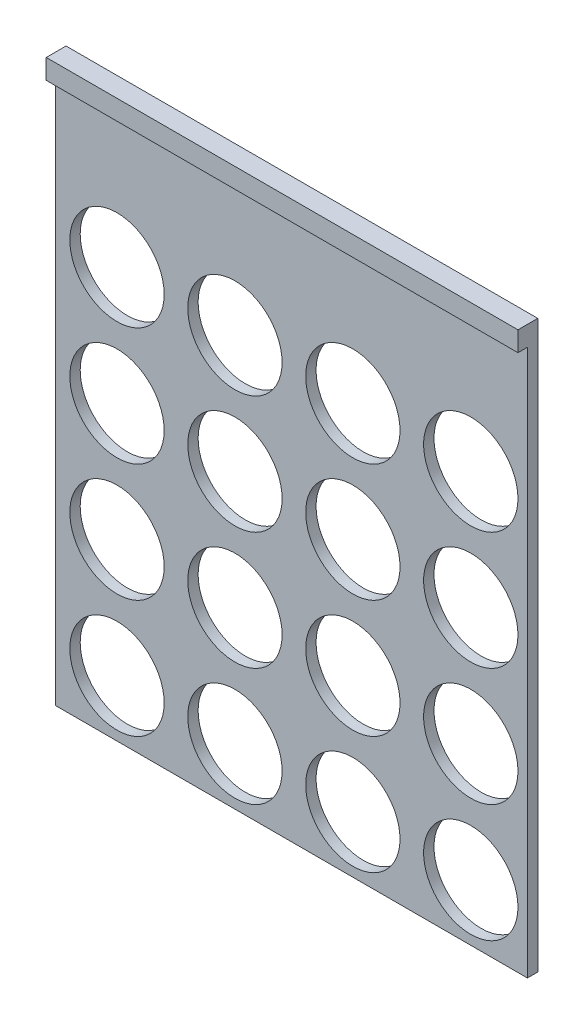
ISO-10303-21;
HEADER;
FILE_DESCRIPTION(('STEP AP214'),'2;1');
FILE_NAME('part.step','',(''),(''),'','','');
FILE_SCHEMA(('AUTOMOTIVE_DESIGN { 1 0 10303 214 1 1 1 1 }'));
ENDSEC;
DATA;
#1=APPLICATION_CONTEXT('core data for automotive mechanical design processes');
#2=APPLICATION_PROTOCOL_DEFINITION('international standard','automotive_design',2000,#1);
#3=PRODUCT_CONTEXT('',#1,'mechanical');
#4=PRODUCT('Part','Part','',(#3));
#5=PRODUCT_RELATED_PRODUCT_CATEGORY('part','',(#4));
#6=PRODUCT_DEFINITION_FORMATION('','',#4);
#7=PRODUCT_DEFINITION_CONTEXT('part definition',#1,'design');
#8=PRODUCT_DEFINITION('design','',#6,#7);
#9=PRODUCT_DEFINITION_SHAPE('','',#8);
#10=(LENGTH_UNIT() NAMED_UNIT(*) SI_UNIT(.MILLI.,.METRE.));
#11=(NAMED_UNIT(*) PLANE_ANGLE_UNIT() SI_UNIT($,.RADIAN.));
#12=(NAMED_UNIT(*) SI_UNIT($,.STERADIAN.) SOLID_ANGLE_UNIT());
#13=UNCERTAINTY_MEASURE_WITH_UNIT(LENGTH_MEASURE(1.E-05),#10,'distance_accuracy_value','');
#14=(GEOMETRIC_REPRESENTATION_CONTEXT(3) GLOBAL_UNCERTAINTY_ASSIGNED_CONTEXT((#13)) GLOBAL_UNIT_ASSIGNED_CONTEXT((#10,
#11,#12)) REPRESENTATION_CONTEXT('',''));
#15=CARTESIAN_POINT('',(0.,0.,0.));
#16=DIRECTION('',(0.,0.,1.));
#17=DIRECTION('',(1.,0.,0.));
#18=AXIS2_PLACEMENT_3D('',#15,#16,#17);
#19=CARTESIAN_POINT('',(0.,0.,2.2));
#20=DIRECTION('',(0.,0.,-1.));
#21=DIRECTION('',(-1.,0.,0.));
#22=AXIS2_PLACEMENT_3D('',#19,#20,#21);
#23=PLANE('',#22);
#24=CARTESIAN_POINT('',(88.,12.,2.2));
#25=DIRECTION('',(0.,0.,1.));
#26=DIRECTION('',(1.,0.,0.));
#27=AXIS2_PLACEMENT_3D('',#24,#25,#26);
#28=CIRCLE('',#27,9.99999999999999);
#29=CARTESIAN_POINT('',(98.,12.,2.2));
#30=VERTEX_POINT('',#29);
#31=EDGE_CURVE('E117',#30,#30,#28,.T.);
#32=ORIENTED_EDGE('',*,*,#31,.F.);
#33=EDGE_LOOP('',(#32));
#34=FACE_BOUND('',#33,.T.);
#35=CARTESIAN_POINT('',(87.9999999999997,87.,2.2));
#36=DIRECTION('',(0.,0.,1.));
#37=DIRECTION('',(1.,0.,0.));
#38=AXIS2_PLACEMENT_3D('',#35,#36,#37);
#39=CIRCLE('',#38,9.99999999999999);
#40=CARTESIAN_POINT('',(97.9999999999997,87.,2.2));
#41=VERTEX_POINT('',#40);
#42=EDGE_CURVE('E228',#41,#41,#39,.T.);
#43=ORIENTED_EDGE('',*,*,#42,.F.);
#44=EDGE_LOOP('',(#43));
#45=FACE_BOUND('',#44,.T.);
#46=CARTESIAN_POINT('',(87.9999999999998,62.,2.2));
#47=DIRECTION('',(0.,0.,1.));
#48=DIRECTION('',(1.,0.,0.));
#49=AXIS2_PLACEMENT_3D('',#46,#47,#48);
#50=CIRCLE('',#49,9.99999999999999);
#51=CARTESIAN_POINT('',(97.9999999999998,62.,2.2));
#52=VERTEX_POINT('',#51);
#53=EDGE_CURVE('E248',#52,#52,#50,.T.);
#54=ORIENTED_EDGE('',*,*,#53,.F.);
#55=EDGE_LOOP('',(#54));
#56=FACE_BOUND('',#55,.T.);
#57=CARTESIAN_POINT('',(87.9999999999999,37.,2.2));
#58=DIRECTION('',(0.,0.,1.));
#59=DIRECTION('',(1.,0.,0.));
#60=AXIS2_PLACEMENT_3D('',#57,#58,#59);
#61=CIRCLE('',#60,9.99999999999999);
#62=CARTESIAN_POINT('',(97.9999999999999,37.,2.2));
#63=VERTEX_POINT('',#62);
#64=EDGE_CURVE('E239',#63,#63,#61,.T.);
#65=ORIENTED_EDGE('',*,*,#64,.F.);
#66=EDGE_LOOP('',(#65));
#67=FACE_BOUND('',#66,.T.);
#68=CARTESIAN_POINT('',(12.9999999999999,61.9999999999995,2.2));
#69=DIRECTION('',(0.,0.,1.));
#70=DIRECTION('',(1.,0.,0.));
#71=AXIS2_PLACEMENT_3D('',#68,#69,#70);
#72=CIRCLE('',#71,9.99999999999999);
#73=CARTESIAN_POINT('',(22.9999999999999,61.9999999999995,2.2));
#74=VERTEX_POINT('',#73);
#75=EDGE_CURVE('E240',#74,#74,#72,.T.);
#76=ORIENTED_EDGE('',*,*,#75,.F.);
#77=EDGE_LOOP('',(#76));
#78=FACE_BOUND('',#77,.T.);
#79=CARTESIAN_POINT('',(62.9999999999998,86.9999999999998,2.2));
#80=DIRECTION('',(0.,0.,1.));
#81=DIRECTION('',(1.,0.,0.));
#82=AXIS2_PLACEMENT_3D('',#79,#80,#81);
#83=CIRCLE('',#82,9.99999999999999);
#84=CARTESIAN_POINT('',(72.9999999999997,86.9999999999998,2.2));
#85=VERTEX_POINT('',#84);
#86=EDGE_CURVE('E235',#85,#85,#83,.T.);
#87=ORIENTED_EDGE('',*,*,#86,.F.);
#88=EDGE_LOOP('',(#87));
#89=FACE_BOUND('',#88,.T.);
#90=CARTESIAN_POINT('',(37.9999999999998,86.9999999999996,2.2));
#91=DIRECTION('',(0.,0.,1.));
#92=DIRECTION('',(1.,0.,0.));
#93=AXIS2_PLACEMENT_3D('',#90,#91,#92);
#94=CIRCLE('',#93,10.);
#95=CARTESIAN_POINT('',(47.9999999999998,86.9999999999996,2.2));
#96=VERTEX_POINT('',#95);
#97=EDGE_CURVE('E232',#96,#96,#94,.T.);
#98=ORIENTED_EDGE('',*,*,#97,.F.);
#99=EDGE_LOOP('',(#98));
#100=FACE_BOUND('',#99,.T.);
#101=CARTESIAN_POINT('',(12.9999999999998,86.9999999999994,2.2));
#102=DIRECTION('',(0.,0.,1.));
#103=DIRECTION('',(1.,0.,0.));
#104=AXIS2_PLACEMENT_3D('',#101,#102,#103);
#105=CIRCLE('',#104,9.99999999999999);
#106=CARTESIAN_POINT('',(22.9999999999998,86.9999999999994,2.2));
#107=VERTEX_POINT('',#106);
#108=EDGE_CURVE('E236',#107,#107,#105,.T.);
#109=ORIENTED_EDGE('',*,*,#108,.F.);
#110=EDGE_LOOP('',(#109));
#111=FACE_BOUND('',#110,.T.);
#112=CARTESIAN_POINT('',(62.9999999999999,36.9999999999998,2.2));
#113=DIRECTION('',(0.,0.,1.));
#114=DIRECTION('',(1.,0.,0.));
#115=AXIS2_PLACEMENT_3D('',#112,#113,#114);
#116=CIRCLE('',#115,9.99999999999999);
#117=CARTESIAN_POINT('',(72.9999999999999,36.9999999999998,2.2));
#118=VERTEX_POINT('',#117);
#119=EDGE_CURVE('E256',#118,#118,#116,.T.);
#120=ORIENTED_EDGE('',*,*,#119,.F.);
#121=EDGE_LOOP('',(#120));
#122=FACE_BOUND('',#121,.T.);
#123=CARTESIAN_POINT('',(13.,11.9999999999995,2.2));
#124=DIRECTION('',(0.,0.,1.));
#125=DIRECTION('',(1.,0.,0.));
#126=AXIS2_PLACEMENT_3D('',#123,#124,#125);
#127=CIRCLE('',#126,9.99999999999999);
#128=CARTESIAN_POINT('',(23.,11.9999999999995,2.2));
#129=VERTEX_POINT('',#128);
#130=EDGE_CURVE('E265',#129,#129,#127,.T.);
#131=ORIENTED_EDGE('',*,*,#130,.F.);
#132=EDGE_LOOP('',(#131));
#133=FACE_BOUND('',#132,.T.);
#134=CARTESIAN_POINT('',(38.,11.9999999999997,2.2));
#135=DIRECTION('',(0.,0.,1.));
#136=DIRECTION('',(1.,0.,0.));
#137=AXIS2_PLACEMENT_3D('',#134,#135,#136);
#138=CIRCLE('',#137,10.);
#139=CARTESIAN_POINT('',(48.,11.9999999999997,2.2));
#140=VERTEX_POINT('',#139);
#141=EDGE_CURVE('E204',#140,#140,#138,.T.);
#142=ORIENTED_EDGE('',*,*,#141,.F.);
#143=EDGE_LOOP('',(#142));
#144=FACE_BOUND('',#143,.T.);
#145=CARTESIAN_POINT('',(63.,11.9999999999998,2.2));
#146=DIRECTION('',(0.,0.,1.));
#147=DIRECTION('',(1.,0.,0.));
#148=AXIS2_PLACEMENT_3D('',#145,#146,#147);
#149=CIRCLE('',#148,10.);
#150=CARTESIAN_POINT('',(73.,11.9999999999998,2.2));
#151=VERTEX_POINT('',#150);
#152=EDGE_CURVE('E201',#151,#151,#149,.T.);
#153=ORIENTED_EDGE('',*,*,#152,.F.);
#154=EDGE_LOOP('',(#153));
#155=FACE_BOUND('',#154,.T.);
#156=CARTESIAN_POINT('',(37.9999999999999,36.9999999999996,2.2));
#157=DIRECTION('',(0.,0.,1.));
#158=DIRECTION('',(1.,0.,0.));
#159=AXIS2_PLACEMENT_3D('',#156,#157,#158);
#160=CIRCLE('',#159,9.99999999999999);
#161=CARTESIAN_POINT('',(47.9999999999999,36.9999999999996,2.2));
#162=VERTEX_POINT('',#161);
#163=EDGE_CURVE('E253',#162,#162,#160,.T.);
#164=ORIENTED_EDGE('',*,*,#163,.F.);
#165=EDGE_LOOP('',(#164));
#166=FACE_BOUND('',#165,.T.);
#167=CARTESIAN_POINT('',(13.,36.9999999999995,2.2));
#168=DIRECTION('',(0.,0.,1.));
#169=DIRECTION('',(1.,0.,0.));
#170=AXIS2_PLACEMENT_3D('',#167,#168,#169);
#171=CIRCLE('',#170,9.99999999999999);
#172=CARTESIAN_POINT('',(23.,36.9999999999995,2.2));
#173=VERTEX_POINT('',#172);
#174=EDGE_CURVE('E257',#173,#173,#171,.T.);
#175=ORIENTED_EDGE('',*,*,#174,.F.);
#176=EDGE_LOOP('',(#175));
#177=FACE_BOUND('',#176,.T.);
#178=CARTESIAN_POINT('',(62.9999999999999,61.9999999999998,2.2));
#179=DIRECTION('',(0.,0.,1.));
#180=DIRECTION('',(1.,0.,0.));
#181=AXIS2_PLACEMENT_3D('',#178,#179,#180);
#182=CIRCLE('',#181,9.99999999999999);
#183=CARTESIAN_POINT('',(72.9999999999998,61.9999999999998,2.2));
#184=VERTEX_POINT('',#183);
#185=EDGE_CURVE('E260',#184,#184,#182,.T.);
#186=ORIENTED_EDGE('',*,*,#185,.F.);
#187=EDGE_LOOP('',(#186));
#188=FACE_BOUND('',#187,.T.);
#189=CARTESIAN_POINT('',(37.9999999999999,61.9999999999996,2.2));
#190=DIRECTION('',(0.,0.,1.));
#191=DIRECTION('',(1.,0.,0.));
#192=AXIS2_PLACEMENT_3D('',#189,#190,#191);
#193=CIRCLE('',#192,9.99999999999999);
#194=CARTESIAN_POINT('',(47.9999999999999,61.9999999999996,2.2));
#195=VERTEX_POINT('',#194);
#196=EDGE_CURVE('E243',#195,#195,#193,.T.);
#197=ORIENTED_EDGE('',*,*,#196,.F.);
#198=EDGE_LOOP('',(#197));
#199=FACE_BOUND('',#198,.T.);
#200=DIRECTION('',(1.,0.,0.));
#201=VECTOR('',#200,1.);
#202=CARTESIAN_POINT('',(0.,115.794440945344,2.2));
#203=LINE('',#202,#201);
#204=CARTESIAN_POINT('',(0.,115.794440945344,2.2));
#205=VERTEX_POINT('',#204);
#206=CARTESIAN_POINT('',(100.,115.794440945344,2.2));
#207=VERTEX_POINT('',#206);
#208=EDGE_CURVE('E50',#205,#207,#203,.T.);
#209=ORIENTED_EDGE('',*,*,#208,.F.);
#210=DIRECTION('',(0.,-1.,0.));
#211=VECTOR('',#210,1.);
#212=CARTESIAN_POINT('',(0.,0.,2.2));
#213=LINE('',#212,#211);
#214=CARTESIAN_POINT('',(0.,0.,2.2));
#215=VERTEX_POINT('',#214);
#216=EDGE_CURVE('E87',#205,#215,#213,.T.);
#217=ORIENTED_EDGE('',*,*,#216,.T.);
#218=DIRECTION('',(1.,0.,0.));
#219=VECTOR('',#218,1.);
#220=CARTESIAN_POINT('',(0.,0.,2.2));
#221=LINE('',#220,#219);
#222=CARTESIAN_POINT('',(100.,0.,2.2));
#223=VERTEX_POINT('',#222);
#224=EDGE_CURVE('E56',#215,#223,#221,.T.);
#225=ORIENTED_EDGE('',*,*,#224,.T.);
#226=DIRECTION('',(0.,1.,0.));
#227=VECTOR('',#226,1.);
#228=CARTESIAN_POINT('',(100.,0.,2.2));
#229=LINE('',#228,#227);
#230=EDGE_CURVE('E98',#223,#207,#229,.T.);
#231=ORIENTED_EDGE('',*,*,#230,.T.);
#232=EDGE_LOOP('',(#209,#217,#225,#231));
#233=FACE_BOUND('',#232,.T.);
#234=ADVANCED_FACE('F33',(#34,#45,#56,#67,#78,#89,#100,#111,#122,#133,#144,#155,#166,#177,#188,
#199,#233),#23,.F.);
#235=CARTESIAN_POINT('',(0.,0.,2.2));
#236=DIRECTION('',(1.,0.,0.));
#237=DIRECTION('',(0.,1.,0.));
#238=AXIS2_PLACEMENT_3D('',#235,#236,#237);
#239=PLANE('',#238);
#240=DIRECTION('',(0.,-1.,0.));
#241=VECTOR('',#240,1.);
#242=CARTESIAN_POINT('',(0.,0.,0.));
#243=LINE('',#242,#241);
#244=CARTESIAN_POINT('',(0.,120.,0.));
#245=VERTEX_POINT('',#244);
#246=CARTESIAN_POINT('',(0.,0.,0.));
#247=VERTEX_POINT('',#246);
#248=EDGE_CURVE('E94',#245,#247,#243,.T.);
#249=ORIENTED_EDGE('',*,*,#248,.T.);
#250=DIRECTION('',(0.,0.,-1.));
#251=VECTOR('',#250,1.);
#252=CARTESIAN_POINT('',(0.,0.,2.2));
#253=LINE('',#252,#251);
#254=EDGE_CURVE('E11',#215,#247,#253,.T.);
#255=ORIENTED_EDGE('',*,*,#254,.F.);
#256=ORIENTED_EDGE('',*,*,#216,.F.);
#257=DIRECTION('',(0.,0.,-1.));
#258=VECTOR('',#257,1.);
#259=CARTESIAN_POINT('',(0.,115.794440945344,4.2));
#260=LINE('',#259,#258);
#261=CARTESIAN_POINT('',(0.,115.794440945344,4.2));
#262=VERTEX_POINT('',#261);
#263=EDGE_CURVE('E221',#262,#205,#260,.T.);
#264=ORIENTED_EDGE('',*,*,#263,.F.);
#265=DIRECTION('',(0.,-1.,0.));
#266=VECTOR('',#265,1.);
#267=CARTESIAN_POINT('',(0.,120.,4.2));
#268=LINE('',#267,#266);
#269=CARTESIAN_POINT('',(0.,120.,4.2));
#270=VERTEX_POINT('',#269);
#271=EDGE_CURVE('E97',#270,#262,#268,.T.);
#272=ORIENTED_EDGE('',*,*,#271,.F.);
#273=DIRECTION('',(0.,0.,-1.));
#274=VECTOR('',#273,1.);
#275=CARTESIAN_POINT('',(0.,120.,2.2));
#276=LINE('',#275,#274);
#277=EDGE_CURVE('E80',#270,#245,#276,.T.);
#278=ORIENTED_EDGE('',*,*,#277,.T.);
#279=EDGE_LOOP('',(#249,#255,#256,#264,#272,#278));
#280=FACE_BOUND('',#279,.T.);
#281=ADVANCED_FACE('F35',(#280),#239,.F.);
#282=CARTESIAN_POINT('',(0.,0.,2.2));
#283=DIRECTION('',(0.,1.,0.));
#284=DIRECTION('',(0.,0.,1.));
#285=AXIS2_PLACEMENT_3D('',#282,#283,#284);
#286=PLANE('',#285);
#287=DIRECTION('',(1.,0.,0.));
#288=VECTOR('',#287,1.);
#289=CARTESIAN_POINT('',(0.,0.,0.));
#290=LINE('',#289,#288);
#291=CARTESIAN_POINT('',(100.,0.,0.));
#292=VERTEX_POINT('',#291);
#293=EDGE_CURVE('E101',#247,#292,#290,.T.);
#294=ORIENTED_EDGE('',*,*,#293,.T.);
#295=DIRECTION('',(0.,0.,-1.));
#296=VECTOR('',#295,1.);
#297=CARTESIAN_POINT('',(100.,0.,2.2));
#298=LINE('',#297,#296);
#299=EDGE_CURVE('E42',#223,#292,#298,.T.);
#300=ORIENTED_EDGE('',*,*,#299,.F.);
#301=ORIENTED_EDGE('',*,*,#224,.F.);
#302=ORIENTED_EDGE('',*,*,#254,.T.);
#303=EDGE_LOOP('',(#294,#300,#301,#302));
#304=FACE_BOUND('',#303,.T.);
#305=ADVANCED_FACE('F325',(#304),#286,.F.);
#306=CARTESIAN_POINT('',(100.,0.,2.2));
#307=DIRECTION('',(-1.,0.,0.));
#308=DIRECTION('',(0.,-1.,0.));
#309=AXIS2_PLACEMENT_3D('',#306,#307,#308);
#310=PLANE('',#309);
#311=DIRECTION('',(0.,1.,0.));
#312=VECTOR('',#311,1.);
#313=CARTESIAN_POINT('',(100.,0.,0.));
#314=LINE('',#313,#312);
#315=CARTESIAN_POINT('',(100.,120.,0.));
#316=VERTEX_POINT('',#315);
#317=EDGE_CURVE('E88',#292,#316,#314,.T.);
#318=ORIENTED_EDGE('',*,*,#317,.T.);
#319=DIRECTION('',(0.,0.,-1.));
#320=VECTOR('',#319,1.);
#321=CARTESIAN_POINT('',(100.,120.,2.2));
#322=LINE('',#321,#320);
#323=CARTESIAN_POINT('',(100.,120.,4.2));
#324=VERTEX_POINT('',#323);
#325=EDGE_CURVE('E83',#324,#316,#322,.T.);
#326=ORIENTED_EDGE('',*,*,#325,.F.);
#327=DIRECTION('',(0.,1.,0.));
#328=VECTOR('',#327,1.);
#329=CARTESIAN_POINT('',(100.,120.,4.2));
#330=LINE('',#329,#328);
#331=CARTESIAN_POINT('',(100.,115.794440945344,4.2));
#332=VERTEX_POINT('',#331);
#333=EDGE_CURVE('E225',#332,#324,#330,.T.);
#334=ORIENTED_EDGE('',*,*,#333,.F.);
#335=DIRECTION('',(0.,0.,-1.));
#336=VECTOR('',#335,1.);
#337=CARTESIAN_POINT('',(100.,115.794440945344,4.2));
#338=LINE('',#337,#336);
#339=EDGE_CURVE('E219',#332,#207,#338,.T.);
#340=ORIENTED_EDGE('',*,*,#339,.T.);
#341=ORIENTED_EDGE('',*,*,#230,.F.);
#342=ORIENTED_EDGE('',*,*,#299,.T.);
#343=EDGE_LOOP('',(#318,#326,#334,#340,#341,#342));
#344=FACE_BOUND('',#343,.T.);
#345=ADVANCED_FACE('F223',(#344),#310,.F.);
#346=CARTESIAN_POINT('',(0.,120.,2.2));
#347=DIRECTION('',(0.,-1.,0.));
#348=DIRECTION('',(0.,0.,-1.));
#349=AXIS2_PLACEMENT_3D('',#346,#347,#348);
#350=PLANE('',#349);
#351=DIRECTION('',(-1.,0.,0.));
#352=VECTOR('',#351,1.);
#353=CARTESIAN_POINT('',(0.,120.,0.));
#354=LINE('',#353,#352);
#355=EDGE_CURVE('E76',#316,#245,#354,.T.);
#356=ORIENTED_EDGE('',*,*,#355,.T.);
#357=ORIENTED_EDGE('',*,*,#277,.F.);
#358=DIRECTION('',(-1.,0.,0.));
#359=VECTOR('',#358,1.);
#360=CARTESIAN_POINT('',(0.,120.,4.2));
#361=LINE('',#360,#359);
#362=EDGE_CURVE('E226',#324,#270,#361,.T.);
#363=ORIENTED_EDGE('',*,*,#362,.F.);
#364=ORIENTED_EDGE('',*,*,#325,.T.);
#365=EDGE_LOOP('',(#356,#357,#363,#364));
#366=FACE_BOUND('',#365,.T.);
#367=ADVANCED_FACE('F78',(#366),#350,.F.);
#368=CARTESIAN_POINT('',(0.,0.,0.));
#369=DIRECTION('',(0.,0.,-1.));
#370=DIRECTION('',(-1.,0.,0.));
#371=AXIS2_PLACEMENT_3D('',#368,#369,#370);
#372=PLANE('',#371);
#373=CARTESIAN_POINT('',(37.9999999999999,61.9999999999996,0.));
#374=DIRECTION('',(0.,0.,-1.));
#375=DIRECTION('',(-1.,0.,0.));
#376=AXIS2_PLACEMENT_3D('',#373,#374,#375);
#377=CIRCLE('',#376,9.99999999999999);
#378=CARTESIAN_POINT('',(27.9999999999999,61.9999999999996,0.));
#379=VERTEX_POINT('',#378);
#380=EDGE_CURVE('E37',#379,#379,#377,.T.);
#381=ORIENTED_EDGE('',*,*,#380,.F.);
#382=EDGE_LOOP('',(#381));
#383=FACE_BOUND('',#382,.T.);
#384=CARTESIAN_POINT('',(62.9999999999999,61.9999999999998,0.));
#385=DIRECTION('',(0.,0.,-1.));
#386=DIRECTION('',(-1.,0.,0.));
#387=AXIS2_PLACEMENT_3D('',#384,#385,#386);
#388=CIRCLE('',#387,9.99999999999999);
#389=CARTESIAN_POINT('',(52.9999999999999,61.9999999999998,0.));
#390=VERTEX_POINT('',#389);
#391=EDGE_CURVE('E105',#390,#390,#388,.T.);
#392=ORIENTED_EDGE('',*,*,#391,.F.);
#393=EDGE_LOOP('',(#392));
#394=FACE_BOUND('',#393,.T.);
#395=CARTESIAN_POINT('',(13.,36.9999999999995,0.));
#396=DIRECTION('',(0.,0.,-1.));
#397=DIRECTION('',(-1.,0.,0.));
#398=AXIS2_PLACEMENT_3D('',#395,#396,#397);
#399=CIRCLE('',#398,9.99999999999999);
#400=CARTESIAN_POINT('',(2.99999999999996,36.9999999999995,0.));
#401=VERTEX_POINT('',#400);
#402=EDGE_CURVE('E153',#401,#401,#399,.T.);
#403=ORIENTED_EDGE('',*,*,#402,.F.);
#404=EDGE_LOOP('',(#403));
#405=FACE_BOUND('',#404,.T.);
#406=CARTESIAN_POINT('',(37.9999999999999,36.9999999999996,0.));
#407=DIRECTION('',(0.,0.,-1.));
#408=DIRECTION('',(-1.,0.,0.));
#409=AXIS2_PLACEMENT_3D('',#406,#407,#408);
#410=CIRCLE('',#409,9.99999999999999);
#411=CARTESIAN_POINT('',(27.9999999999999,36.9999999999996,0.));
#412=VERTEX_POINT('',#411);
#413=EDGE_CURVE('E150',#412,#412,#410,.T.);
#414=ORIENTED_EDGE('',*,*,#413,.F.);
#415=EDGE_LOOP('',(#414));
#416=FACE_BOUND('',#415,.T.);
#417=CARTESIAN_POINT('',(63.,11.9999999999998,0.));
#418=DIRECTION('',(0.,0.,-1.));
#419=DIRECTION('',(-1.,0.,0.));
#420=AXIS2_PLACEMENT_3D('',#417,#418,#419);
#421=CIRCLE('',#420,10.);
#422=CARTESIAN_POINT('',(53.,11.9999999999998,0.));
#423=VERTEX_POINT('',#422);
#424=EDGE_CURVE('E147',#423,#423,#421,.T.);
#425=ORIENTED_EDGE('',*,*,#424,.F.);
#426=EDGE_LOOP('',(#425));
#427=FACE_BOUND('',#426,.T.);
#428=CARTESIAN_POINT('',(38.,11.9999999999997,0.));
#429=DIRECTION('',(0.,0.,-1.));
#430=DIRECTION('',(-1.,0.,0.));
#431=AXIS2_PLACEMENT_3D('',#428,#429,#430);
#432=CIRCLE('',#431,10.);
#433=CARTESIAN_POINT('',(28.,11.9999999999997,0.));
#434=VERTEX_POINT('',#433);
#435=EDGE_CURVE('E144',#434,#434,#432,.T.);
#436=ORIENTED_EDGE('',*,*,#435,.F.);
#437=EDGE_LOOP('',(#436));
#438=FACE_BOUND('',#437,.T.);
#439=CARTESIAN_POINT('',(13.,11.9999999999995,0.));
#440=DIRECTION('',(0.,0.,-1.));
#441=DIRECTION('',(-1.,0.,0.));
#442=AXIS2_PLACEMENT_3D('',#439,#440,#441);
#443=CIRCLE('',#442,9.99999999999999);
#444=CARTESIAN_POINT('',(3.00000000000004,11.9999999999995,0.));
#445=VERTEX_POINT('',#444);
#446=EDGE_CURVE('E141',#445,#445,#443,.T.);
#447=ORIENTED_EDGE('',*,*,#446,.F.);
#448=EDGE_LOOP('',(#447));
#449=FACE_BOUND('',#448,.T.);
#450=CARTESIAN_POINT('',(62.9999999999999,36.9999999999998,0.));
#451=DIRECTION('',(0.,0.,-1.));
#452=DIRECTION('',(-1.,0.,0.));
#453=AXIS2_PLACEMENT_3D('',#450,#451,#452);
#454=CIRCLE('',#453,9.99999999999999);
#455=CARTESIAN_POINT('',(52.9999999999999,36.9999999999998,0.));
#456=VERTEX_POINT('',#455);
#457=EDGE_CURVE('E138',#456,#456,#454,.T.);
#458=ORIENTED_EDGE('',*,*,#457,.F.);
#459=EDGE_LOOP('',(#458));
#460=FACE_BOUND('',#459,.T.);
#461=CARTESIAN_POINT('',(12.9999999999998,86.9999999999994,0.));
#462=DIRECTION('',(0.,0.,-1.));
#463=DIRECTION('',(-1.,0.,0.));
#464=AXIS2_PLACEMENT_3D('',#461,#462,#463);
#465=CIRCLE('',#464,9.99999999999999);
#466=CARTESIAN_POINT('',(2.99999999999978,86.9999999999994,0.));
#467=VERTEX_POINT('',#466);
#468=EDGE_CURVE('E135',#467,#467,#465,.T.);
#469=ORIENTED_EDGE('',*,*,#468,.F.);
#470=EDGE_LOOP('',(#469));
#471=FACE_BOUND('',#470,.T.);
#472=CARTESIAN_POINT('',(37.9999999999998,86.9999999999996,0.));
#473=DIRECTION('',(0.,0.,-1.));
#474=DIRECTION('',(-1.,0.,0.));
#475=AXIS2_PLACEMENT_3D('',#472,#473,#474);
#476=CIRCLE('',#475,10.);
#477=CARTESIAN_POINT('',(27.9999999999998,86.9999999999996,0.));
#478=VERTEX_POINT('',#477);
#479=EDGE_CURVE('E132',#478,#478,#476,.T.);
#480=ORIENTED_EDGE('',*,*,#479,.F.);
#481=EDGE_LOOP('',(#480));
#482=FACE_BOUND('',#481,.T.);
#483=CARTESIAN_POINT('',(62.9999999999998,86.9999999999998,0.));
#484=DIRECTION('',(0.,0.,-1.));
#485=DIRECTION('',(-1.,0.,0.));
#486=AXIS2_PLACEMENT_3D('',#483,#484,#485);
#487=CIRCLE('',#486,9.99999999999999);
#488=CARTESIAN_POINT('',(52.9999999999998,86.9999999999998,0.));
#489=VERTEX_POINT('',#488);
#490=EDGE_CURVE('E129',#489,#489,#487,.T.);
#491=ORIENTED_EDGE('',*,*,#490,.F.);
#492=EDGE_LOOP('',(#491));
#493=FACE_BOUND('',#492,.T.);
#494=CARTESIAN_POINT('',(12.9999999999999,61.9999999999995,0.));
#495=DIRECTION('',(0.,0.,-1.));
#496=DIRECTION('',(-1.,0.,0.));
#497=AXIS2_PLACEMENT_3D('',#494,#495,#496);
#498=CIRCLE('',#497,9.99999999999999);
#499=CARTESIAN_POINT('',(2.99999999999987,61.9999999999995,0.));
#500=VERTEX_POINT('',#499);
#501=EDGE_CURVE('E126',#500,#500,#498,.T.);
#502=ORIENTED_EDGE('',*,*,#501,.F.);
#503=EDGE_LOOP('',(#502));
#504=FACE_BOUND('',#503,.T.);
#505=CARTESIAN_POINT('',(87.9999999999999,37.,0.));
#506=DIRECTION('',(0.,0.,-1.));
#507=DIRECTION('',(-1.,0.,0.));
#508=AXIS2_PLACEMENT_3D('',#505,#506,#507);
#509=CIRCLE('',#508,9.99999999999999);
#510=CARTESIAN_POINT('',(77.9999999999999,37.,0.));
#511=VERTEX_POINT('',#510);
#512=EDGE_CURVE('E123',#511,#511,#509,.T.);
#513=ORIENTED_EDGE('',*,*,#512,.F.);
#514=EDGE_LOOP('',(#513));
#515=FACE_BOUND('',#514,.T.);
#516=CARTESIAN_POINT('',(87.9999999999998,62.,0.));
#517=DIRECTION('',(0.,0.,-1.));
#518=DIRECTION('',(-1.,0.,0.));
#519=AXIS2_PLACEMENT_3D('',#516,#517,#518);
#520=CIRCLE('',#519,9.99999999999999);
#521=CARTESIAN_POINT('',(77.9999999999998,62.,0.));
#522=VERTEX_POINT('',#521);
#523=EDGE_CURVE('E120',#522,#522,#520,.T.);
#524=ORIENTED_EDGE('',*,*,#523,.F.);
#525=EDGE_LOOP('',(#524));
#526=FACE_BOUND('',#525,.T.);
#527=CARTESIAN_POINT('',(87.9999999999997,87.,0.));
#528=DIRECTION('',(0.,0.,-1.));
#529=DIRECTION('',(-1.,0.,0.));
#530=AXIS2_PLACEMENT_3D('',#527,#528,#529);
#531=CIRCLE('',#530,9.99999999999999);
#532=CARTESIAN_POINT('',(77.9999999999997,87.,0.));
#533=VERTEX_POINT('',#532);
#534=EDGE_CURVE('E116',#533,#533,#531,.T.);
#535=ORIENTED_EDGE('',*,*,#534,.F.);
#536=EDGE_LOOP('',(#535));
#537=FACE_BOUND('',#536,.T.);
#538=CARTESIAN_POINT('',(88.,12.,0.));
#539=DIRECTION('',(0.,0.,-1.));
#540=DIRECTION('',(-1.,0.,0.));
#541=AXIS2_PLACEMENT_3D('',#538,#539,#540);
#542=CIRCLE('',#541,9.99999999999999);
#543=CARTESIAN_POINT('',(78.,12.,0.));
#544=VERTEX_POINT('',#543);
#545=EDGE_CURVE('E113',#544,#544,#542,.T.);
#546=ORIENTED_EDGE('',*,*,#545,.F.);
#547=EDGE_LOOP('',(#546));
#548=FACE_BOUND('',#547,.T.);
#549=ORIENTED_EDGE('',*,*,#248,.F.);
#550=ORIENTED_EDGE('',*,*,#355,.F.);
#551=ORIENTED_EDGE('',*,*,#317,.F.);
#552=ORIENTED_EDGE('',*,*,#293,.F.);
#553=EDGE_LOOP('',(#549,#550,#551,#552));
#554=FACE_BOUND('',#553,.T.);
#555=ADVANCED_FACE('F100',(#383,#394,#405,#416,#427,#438,#449,#460,#471,#482,#493,#504,#515,
#526,#537,#548,#554),#372,.T.);
#556=CARTESIAN_POINT('',(88.,12.,-7.8));
#557=DIRECTION('',(0.,0.,1.));
#558=DIRECTION('',(1.,0.,0.));
#559=AXIS2_PLACEMENT_3D('',#556,#557,#558);
#560=CYLINDRICAL_SURFACE('',#559,9.99999999999999);
#561=ORIENTED_EDGE('',*,*,#545,.T.);
#562=EDGE_LOOP('',(#561));
#563=FACE_BOUND('',#562,.T.);
#564=ORIENTED_EDGE('',*,*,#31,.T.);
#565=EDGE_LOOP('',(#564));
#566=FACE_BOUND('',#565,.T.);
#567=ADVANCED_FACE('F163',(#563,#566),#560,.F.);
#568=CARTESIAN_POINT('',(87.9999999999997,87.,-7.8));
#569=DIRECTION('',(0.,0.,1.));
#570=DIRECTION('',(1.,0.,0.));
#571=AXIS2_PLACEMENT_3D('',#568,#569,#570);
#572=CYLINDRICAL_SURFACE('',#571,9.99999999999999);
#573=ORIENTED_EDGE('',*,*,#534,.T.);
#574=EDGE_LOOP('',(#573));
#575=FACE_BOUND('',#574,.T.);
#576=ORIENTED_EDGE('',*,*,#42,.T.);
#577=EDGE_LOOP('',(#576));
#578=FACE_BOUND('',#577,.T.);
#579=ADVANCED_FACE('F196',(#575,#578),#572,.F.);
#580=CARTESIAN_POINT('',(87.9999999999998,62.,-7.8));
#581=DIRECTION('',(0.,0.,1.));
#582=DIRECTION('',(1.,0.,0.));
#583=AXIS2_PLACEMENT_3D('',#580,#581,#582);
#584=CYLINDRICAL_SURFACE('',#583,9.99999999999999);
#585=ORIENTED_EDGE('',*,*,#523,.T.);
#586=EDGE_LOOP('',(#585));
#587=FACE_BOUND('',#586,.T.);
#588=ORIENTED_EDGE('',*,*,#53,.T.);
#589=EDGE_LOOP('',(#588));
#590=FACE_BOUND('',#589,.T.);
#591=ADVANCED_FACE('F365',(#587,#590),#584,.F.);
#592=CARTESIAN_POINT('',(87.9999999999999,37.,-7.8));
#593=DIRECTION('',(0.,0.,1.));
#594=DIRECTION('',(1.,0.,0.));
#595=AXIS2_PLACEMENT_3D('',#592,#593,#594);
#596=CYLINDRICAL_SURFACE('',#595,9.99999999999999);
#597=ORIENTED_EDGE('',*,*,#512,.T.);
#598=EDGE_LOOP('',(#597));
#599=FACE_BOUND('',#598,.T.);
#600=ORIENTED_EDGE('',*,*,#64,.T.);
#601=EDGE_LOOP('',(#600));
#602=FACE_BOUND('',#601,.T.);
#603=ADVANCED_FACE('F358',(#599,#602),#596,.F.);
#604=CARTESIAN_POINT('',(12.9999999999999,61.9999999999995,-7.8));
#605=DIRECTION('',(0.,0.,1.));
#606=DIRECTION('',(1.,0.,0.));
#607=AXIS2_PLACEMENT_3D('',#604,#605,#606);
#608=CYLINDRICAL_SURFACE('',#607,9.99999999999999);
#609=ORIENTED_EDGE('',*,*,#501,.T.);
#610=EDGE_LOOP('',(#609));
#611=FACE_BOUND('',#610,.T.);
#612=ORIENTED_EDGE('',*,*,#75,.T.);
#613=EDGE_LOOP('',(#612));
#614=FACE_BOUND('',#613,.T.);
#615=ADVANCED_FACE('F355',(#611,#614),#608,.F.);
#616=CARTESIAN_POINT('',(62.9999999999998,86.9999999999998,-7.8));
#617=DIRECTION('',(0.,0.,1.));
#618=DIRECTION('',(1.,0.,0.));
#619=AXIS2_PLACEMENT_3D('',#616,#617,#618);
#620=CYLINDRICAL_SURFACE('',#619,9.99999999999999);
#621=ORIENTED_EDGE('',*,*,#490,.T.);
#622=EDGE_LOOP('',(#621));
#623=FACE_BOUND('',#622,.T.);
#624=ORIENTED_EDGE('',*,*,#86,.T.);
#625=EDGE_LOOP('',(#624));
#626=FACE_BOUND('',#625,.T.);
#627=ADVANCED_FACE('F350',(#623,#626),#620,.F.);
#628=CARTESIAN_POINT('',(37.9999999999998,86.9999999999996,-7.8));
#629=DIRECTION('',(0.,0.,1.));
#630=DIRECTION('',(1.,0.,0.));
#631=AXIS2_PLACEMENT_3D('',#628,#629,#630);
#632=CYLINDRICAL_SURFACE('',#631,10.);
#633=ORIENTED_EDGE('',*,*,#479,.T.);
#634=EDGE_LOOP('',(#633));
#635=FACE_BOUND('',#634,.T.);
#636=ORIENTED_EDGE('',*,*,#97,.T.);
#637=EDGE_LOOP('',(#636));
#638=FACE_BOUND('',#637,.T.);
#639=ADVANCED_FACE('F347',(#635,#638),#632,.F.);
#640=CARTESIAN_POINT('',(12.9999999999998,86.9999999999994,-7.8));
#641=DIRECTION('',(0.,0.,1.));
#642=DIRECTION('',(1.,0.,0.));
#643=AXIS2_PLACEMENT_3D('',#640,#641,#642);
#644=CYLINDRICAL_SURFACE('',#643,9.99999999999999);
#645=ORIENTED_EDGE('',*,*,#468,.T.);
#646=EDGE_LOOP('',(#645));
#647=FACE_BOUND('',#646,.T.);
#648=ORIENTED_EDGE('',*,*,#108,.T.);
#649=EDGE_LOOP('',(#648));
#650=FACE_BOUND('',#649,.T.);
#651=ADVANCED_FACE('F312',(#647,#650),#644,.F.);
#652=CARTESIAN_POINT('',(62.9999999999999,36.9999999999998,-7.8));
#653=DIRECTION('',(0.,0.,1.));
#654=DIRECTION('',(1.,0.,0.));
#655=AXIS2_PLACEMENT_3D('',#652,#653,#654);
#656=CYLINDRICAL_SURFACE('',#655,9.99999999999999);
#657=ORIENTED_EDGE('',*,*,#457,.T.);
#658=EDGE_LOOP('',(#657));
#659=FACE_BOUND('',#658,.T.);
#660=ORIENTED_EDGE('',*,*,#119,.T.);
#661=EDGE_LOOP('',(#660));
#662=FACE_BOUND('',#661,.T.);
#663=ADVANCED_FACE('F271',(#659,#662),#656,.F.);
#664=CARTESIAN_POINT('',(13.,11.9999999999995,-7.8));
#665=DIRECTION('',(0.,0.,1.));
#666=DIRECTION('',(1.,0.,0.));
#667=AXIS2_PLACEMENT_3D('',#664,#665,#666);
#668=CYLINDRICAL_SURFACE('',#667,9.99999999999999);
#669=ORIENTED_EDGE('',*,*,#446,.T.);
#670=EDGE_LOOP('',(#669));
#671=FACE_BOUND('',#670,.T.);
#672=ORIENTED_EDGE('',*,*,#130,.T.);
#673=EDGE_LOOP('',(#672));
#674=FACE_BOUND('',#673,.T.);
#675=ADVANCED_FACE('F305',(#671,#674),#668,.F.);
#676=CARTESIAN_POINT('',(38.,11.9999999999997,-7.8));
#677=DIRECTION('',(0.,0.,1.));
#678=DIRECTION('',(1.,0.,0.));
#679=AXIS2_PLACEMENT_3D('',#676,#677,#678);
#680=CYLINDRICAL_SURFACE('',#679,10.);
#681=ORIENTED_EDGE('',*,*,#435,.T.);
#682=EDGE_LOOP('',(#681));
#683=FACE_BOUND('',#682,.T.);
#684=ORIENTED_EDGE('',*,*,#141,.T.);
#685=EDGE_LOOP('',(#684));
#686=FACE_BOUND('',#685,.T.);
#687=ADVANCED_FACE('F308',(#683,#686),#680,.F.);
#688=CARTESIAN_POINT('',(63.,11.9999999999998,-7.8));
#689=DIRECTION('',(0.,0.,1.));
#690=DIRECTION('',(1.,0.,0.));
#691=AXIS2_PLACEMENT_3D('',#688,#689,#690);
#692=CYLINDRICAL_SURFACE('',#691,10.);
#693=ORIENTED_EDGE('',*,*,#424,.T.);
#694=EDGE_LOOP('',(#693));
#695=FACE_BOUND('',#694,.T.);
#696=ORIENTED_EDGE('',*,*,#152,.T.);
#697=EDGE_LOOP('',(#696));
#698=FACE_BOUND('',#697,.T.);
#699=ADVANCED_FACE('F314',(#695,#698),#692,.F.);
#700=CARTESIAN_POINT('',(37.9999999999999,36.9999999999996,-7.8));
#701=DIRECTION('',(0.,0.,1.));
#702=DIRECTION('',(1.,0.,0.));
#703=AXIS2_PLACEMENT_3D('',#700,#701,#702);
#704=CYLINDRICAL_SURFACE('',#703,9.99999999999999);
#705=ORIENTED_EDGE('',*,*,#413,.T.);
#706=EDGE_LOOP('',(#705));
#707=FACE_BOUND('',#706,.T.);
#708=ORIENTED_EDGE('',*,*,#163,.T.);
#709=EDGE_LOOP('',(#708));
#710=FACE_BOUND('',#709,.T.);
#711=ADVANCED_FACE('F317',(#707,#710),#704,.F.);
#712=CARTESIAN_POINT('',(13.,36.9999999999995,-7.8));
#713=DIRECTION('',(0.,0.,1.));
#714=DIRECTION('',(1.,0.,0.));
#715=AXIS2_PLACEMENT_3D('',#712,#713,#714);
#716=CYLINDRICAL_SURFACE('',#715,9.99999999999999);
#717=ORIENTED_EDGE('',*,*,#402,.T.);
#718=EDGE_LOOP('',(#717));
#719=FACE_BOUND('',#718,.T.);
#720=ORIENTED_EDGE('',*,*,#174,.T.);
#721=EDGE_LOOP('',(#720));
#722=FACE_BOUND('',#721,.T.);
#723=ADVANCED_FACE('F301',(#719,#722),#716,.F.);
#724=CARTESIAN_POINT('',(62.9999999999999,61.9999999999998,-7.8));
#725=DIRECTION('',(0.,0.,1.));
#726=DIRECTION('',(1.,0.,0.));
#727=AXIS2_PLACEMENT_3D('',#724,#725,#726);
#728=CYLINDRICAL_SURFACE('',#727,9.99999999999999);
#729=ORIENTED_EDGE('',*,*,#391,.T.);
#730=EDGE_LOOP('',(#729));
#731=FACE_BOUND('',#730,.T.);
#732=ORIENTED_EDGE('',*,*,#185,.T.);
#733=EDGE_LOOP('',(#732));
#734=FACE_BOUND('',#733,.T.);
#735=ADVANCED_FACE('F158',(#731,#734),#728,.F.);
#736=CARTESIAN_POINT('',(37.9999999999999,61.9999999999996,-7.8));
#737=DIRECTION('',(0.,0.,1.));
#738=DIRECTION('',(1.,0.,0.));
#739=AXIS2_PLACEMENT_3D('',#736,#737,#738);
#740=CYLINDRICAL_SURFACE('',#739,9.99999999999999);
#741=ORIENTED_EDGE('',*,*,#380,.T.);
#742=EDGE_LOOP('',(#741));
#743=FACE_BOUND('',#742,.T.);
#744=ORIENTED_EDGE('',*,*,#196,.T.);
#745=EDGE_LOOP('',(#744));
#746=FACE_BOUND('',#745,.T.);
#747=ADVANCED_FACE('F291',(#743,#746),#740,.F.);
#748=CARTESIAN_POINT('',(0.,115.794440945344,4.2));
#749=DIRECTION('',(0.,1.,0.));
#750=DIRECTION('',(0.,0.,1.));
#751=AXIS2_PLACEMENT_3D('',#748,#749,#750);
#752=PLANE('',#751);
#753=ORIENTED_EDGE('',*,*,#208,.T.);
#754=ORIENTED_EDGE('',*,*,#339,.F.);
#755=DIRECTION('',(1.,0.,0.));
#756=VECTOR('',#755,1.);
#757=CARTESIAN_POINT('',(0.,115.794440945344,4.2));
#758=LINE('',#757,#756);
#759=EDGE_CURVE('E335',#262,#332,#758,.T.);
#760=ORIENTED_EDGE('',*,*,#759,.F.);
#761=ORIENTED_EDGE('',*,*,#263,.T.);
#762=EDGE_LOOP('',(#753,#754,#760,#761));
#763=FACE_BOUND('',#762,.T.);
#764=ADVANCED_FACE('F216',(#763),#752,.F.);
#765=CARTESIAN_POINT('',(0.,0.,4.2));
#766=DIRECTION('',(0.,0.,1.));
#767=DIRECTION('',(1.,0.,0.));
#768=AXIS2_PLACEMENT_3D('',#765,#766,#767);
#769=PLANE('',#768);
#770=ORIENTED_EDGE('',*,*,#271,.T.);
#771=ORIENTED_EDGE('',*,*,#759,.T.);
#772=ORIENTED_EDGE('',*,*,#333,.T.);
#773=ORIENTED_EDGE('',*,*,#362,.T.);
#774=EDGE_LOOP('',(#770,#771,#772,#773));
#775=FACE_BOUND('',#774,.T.);
#776=ADVANCED_FACE('F299',(#775),#769,.T.);
#777=CLOSED_SHELL('',(#234,#281,#305,#345,#367,#555,#567,#579,#591,#603,#615,#627,#639,#651,
#663,#675,#687,#699,#711,#723,#735,#747,#764,#776));
#778=MANIFOLD_SOLID_BREP('B2',#777);
#779=ADVANCED_BREP_SHAPE_REPRESENTATION('',(#18,#778),#14);
#780=SHAPE_DEFINITION_REPRESENTATION(#9,#779);
ENDSEC;
END-ISO-10303-21;
